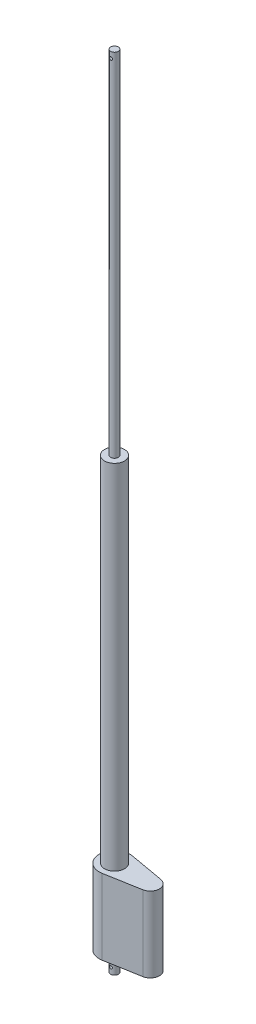
ISO-10303-21;
HEADER;
FILE_DESCRIPTION(('STEP AP214'),'2;1');
FILE_NAME('part.step','',(''),(''),'','','');
FILE_SCHEMA(('AUTOMOTIVE_DESIGN { 1 0 10303 214 1 1 1 1 }'));
ENDSEC;
DATA;
#1=APPLICATION_CONTEXT('core data for automotive mechanical design processes');
#2=APPLICATION_PROTOCOL_DEFINITION('international standard','automotive_design',2000,#1);
#3=PRODUCT_CONTEXT('',#1,'mechanical');
#4=PRODUCT('Part','Part','',(#3));
#5=PRODUCT_RELATED_PRODUCT_CATEGORY('part','',(#4));
#6=PRODUCT_DEFINITION_FORMATION('','',#4);
#7=PRODUCT_DEFINITION_CONTEXT('part definition',#1,'design');
#8=PRODUCT_DEFINITION('design','',#6,#7);
#9=PRODUCT_DEFINITION_SHAPE('','',#8);
#10=(LENGTH_UNIT() NAMED_UNIT(*) SI_UNIT(.MILLI.,.METRE.));
#11=(NAMED_UNIT(*) PLANE_ANGLE_UNIT() SI_UNIT($,.RADIAN.));
#12=(NAMED_UNIT(*) SI_UNIT($,.STERADIAN.) SOLID_ANGLE_UNIT());
#13=UNCERTAINTY_MEASURE_WITH_UNIT(LENGTH_MEASURE(1.E-05),#10,'distance_accuracy_value','');
#14=(GEOMETRIC_REPRESENTATION_CONTEXT(3) GLOBAL_UNCERTAINTY_ASSIGNED_CONTEXT((#13)) GLOBAL_UNIT_ASSIGNED_CONTEXT((#10,
#11,#12)) REPRESENTATION_CONTEXT('',''));
#15=CARTESIAN_POINT('',(0.,0.,0.));
#16=DIRECTION('',(0.,0.,1.));
#17=DIRECTION('',(1.,0.,0.));
#18=AXIS2_PLACEMENT_3D('',#15,#16,#17);
#19=CARTESIAN_POINT('',(0.,1033.,0.));
#20=DIRECTION('',(0.,1.,0.));
#21=DIRECTION('',(0.,0.,1.));
#22=AXIS2_PLACEMENT_3D('',#19,#20,#21);
#23=CYLINDRICAL_SURFACE('',#22,4.99999999999996);
#24=CARTESIAN_POINT('',(0.,-2.,4.99999999999983));
#25=CARTESIAN_POINT('',(0.107493005442892,-1.99999014817627,4.99999271227068));
#26=CARTESIAN_POINT('',(0.215172564090674,-1.99128224791163,4.99649294306916));
#27=CARTESIAN_POINT('',(0.427496480417897,-1.95675229647877,4.98283453100625));
#28=CARTESIAN_POINT('',(0.532131777561248,-1.93088372091387,4.9726577869886));
#29=CARTESIAN_POINT('',(0.734953922727402,-1.86312392194117,4.94674209213102));
#30=CARTESIAN_POINT('',(0.833160661616957,-1.82128515378328,4.93102136364055));
#31=CARTESIAN_POINT('',(1.02107197032837,-1.72298082667346,4.89556610796061));
#32=CARTESIAN_POINT('',(1.11077947675099,-1.66652034508108,4.8758329745804));
#33=CARTESIAN_POINT('',(1.28350100757039,-1.53776450143907,4.83330886170402));
#34=CARTESIAN_POINT('',(1.36606227255021,-1.46489334375974,4.81042296929174));
#35=CARTESIAN_POINT('',(1.51817500478472,-1.30659999652323,4.76460576906177));
#36=CARTESIAN_POINT('',(1.58772010713353,-1.22117170278827,4.74167444453775));
#37=CARTESIAN_POINT('',(1.71487456729288,-1.03557192975774,4.69722791797119));
#38=CARTESIAN_POINT('',(1.77181498119547,-0.934913513976811,4.67582115964934));
#39=CARTESIAN_POINT('',(1.86775471903715,-0.724463601579966,4.63833647186775));
#40=CARTESIAN_POINT('',(1.90676256428583,-0.614676472151647,4.62225601244159));
#41=CARTESIAN_POINT('',(1.96389882339587,-0.394287666407905,4.59826357660801));
#42=CARTESIAN_POINT('',(1.98289396580565,-0.283948764423795,4.59001420355588));
#43=CARTESIAN_POINT('',(2.00217296164003,-0.0613650016927403,4.58164004049127));
#44=CARTESIAN_POINT('',(2.00246601631322,0.0508788946250068,4.58151125522751));
#45=CARTESIAN_POINT('',(1.98498936750454,0.265756671458036,4.58910500279977));
#46=CARTESIAN_POINT('',(1.96847531430514,0.368515714409023,4.59628175038433));
#47=CARTESIAN_POINT('',(1.91994688029782,0.569659556006705,4.61676187607819));
#48=CARTESIAN_POINT('',(1.88792979480463,0.668043588110299,4.63006632321656));
#49=CARTESIAN_POINT('',(1.80869473255107,0.860017836196033,4.66159485088513));
#50=CARTESIAN_POINT('',(1.76117986231532,0.953469239054682,4.67991379280771));
#51=CARTESIAN_POINT('',(1.65250646073221,1.13141581636156,4.71938116389873));
#52=CARTESIAN_POINT('',(1.59134280510084,1.2159076094028,4.74053065456831));
#53=CARTESIAN_POINT('',(1.45155059945444,1.38040972880199,4.78526736742254));
#54=CARTESIAN_POINT('',(1.37193746297064,1.45956872944601,4.80891664976135));
#55=CARTESIAN_POINT('',(1.2003144274302,1.60368447800203,4.85459824958265));
#56=CARTESIAN_POINT('',(1.10830206533444,1.66863839741028,4.87663024445308));
#57=CARTESIAN_POINT('',(0.912077652605846,1.78361744741582,4.91714681264532));
#58=CARTESIAN_POINT('',(0.807660491346481,1.83332228119704,4.93555270095398));
#59=CARTESIAN_POINT('',(0.591023765482885,1.91416786107805,4.96614828328742));
#60=CARTESIAN_POINT('',(0.478808196849677,1.9453180375574,4.97834113462365));
#61=CARTESIAN_POINT('',(0.256895887607823,1.9864482954197,4.99456139506894));
#62=CARTESIAN_POINT('',(0.147443293985538,1.99757245425355,4.99902945833497));
#63=CARTESIAN_POINT('',(-0.0718453098078142,2.00171310052861,5.00068478510614));
#64=CARTESIAN_POINT('',(-0.181681213223921,1.9947342815475,4.99787393582275));
#65=CARTESIAN_POINT('',(-0.393432739121984,1.963708247448,4.98557567063736));
#66=CARTESIAN_POINT('',(-0.495482491775471,1.94044201964902,4.97639391345507));
#67=CARTESIAN_POINT('',(-0.694135428060777,1.87856429169018,4.95259441405483));
#68=CARTESIAN_POINT('',(-0.790737910224841,1.83995082033131,4.93797597356514));
#69=CARTESIAN_POINT('',(-0.979078785816699,1.74721506032005,4.90416594770795));
#70=CARTESIAN_POINT('',(-1.0705780227554,1.69265452795685,4.88484815979787));
#71=CARTESIAN_POINT('',(-1.24344359124655,1.57005967609435,4.84373364745508));
#72=CARTESIAN_POINT('',(-1.32480584076112,1.50201995707738,4.82193593110254));
#73=CARTESIAN_POINT('',(-1.48072304302882,1.34912998705037,4.77645117638095));
#74=CARTESIAN_POINT('',(-1.55447393380606,1.26346645849379,4.75273441425035));
#75=CARTESIAN_POINT('',(-1.68675119741371,1.08055991699063,4.70741672917115));
#76=CARTESIAN_POINT('',(-1.74527506133751,0.983314999660049,4.68581615526494));
#77=CARTESIAN_POINT('',(-1.84580750193163,0.778538305405892,4.64714299907692));
#78=CARTESIAN_POINT('',(-1.88765059453445,0.670916000787687,4.63011630884771));
#79=CARTESIAN_POINT('',(-1.9522962197053,0.449266348284842,4.60323673477914));
#80=CARTESIAN_POINT('',(-1.97511280526931,0.335243794187572,4.59337855695981));
#81=CARTESIAN_POINT('',(-1.9997156172784,0.112872098225455,4.58271759299909));
#82=CARTESIAN_POINT('',(-2.00289708230287,0.0047051604066476,4.58131421008154));
#83=CARTESIAN_POINT('',(-1.99180315927752,-0.210544857713295,4.58614836033081));
#84=CARTESIAN_POINT('',(-1.97752998791378,-0.317628073902586,4.59238492324776));
#85=CARTESIAN_POINT('',(-1.93307136615365,-0.523332189855044,4.61126649079003));
#86=CARTESIAN_POINT('',(-1.90353749357098,-0.622120274433001,4.62364831827432));
#87=CARTESIAN_POINT('',(-1.83000544849101,-0.813378629613485,4.65324001232679));
#88=CARTESIAN_POINT('',(-1.78600328139382,-0.905847146899828,4.6704512120599));
#89=CARTESIAN_POINT('',(-1.68187276275973,-1.08760961927078,4.70898609604474));
#90=CARTESIAN_POINT('',(-1.62096533515949,-1.17641867013049,4.73048882313225));
#91=CARTESIAN_POINT('',(-1.4858921192715,-1.34299331720376,4.7746380437222));
#92=CARTESIAN_POINT('',(-1.41172233481813,-1.42075557212832,4.79728488048389));
#93=CARTESIAN_POINT('',(-1.24650550627247,-1.56820285326362,4.84293567087377));
#94=CARTESIAN_POINT('',(-1.15467600114614,-1.63703730689807,4.86586757962168));
#95=CARTESIAN_POINT('',(-0.959900320285786,-1.75833704262164,4.908004067137));
#96=CARTESIAN_POINT('',(-0.856949004547244,-1.81079471215253,4.92720691092889));
#97=CARTESIAN_POINT('',(-0.644738062495209,-1.89662221519029,4.95939714815844));
#98=CARTESIAN_POINT('',(-0.535631618219701,-1.93032932356034,4.97249363055011));
#99=CARTESIAN_POINT('',(-0.312876546281226,-1.97863912095427,4.99144306209349));
#100=CARTESIAN_POINT('',(-0.199243525858918,-1.99330243674391,4.99731899495621));
#101=CARTESIAN_POINT('',(-0.0569122978909333,-1.99939538097828,4.9997589950412));
#102=CARTESIAN_POINT('',(-0.0284626887407602,-2.0000026086292,5.00000192969159));
#103=CARTESIAN_POINT('',(0.,-2.,4.99999999999983));
#104=B_SPLINE_CURVE_WITH_KNOTS('',3,(#24,#25,#26,#27,#28,#29,#30,#31,#32,#33,#34,#35,#36,#37,
#38,#39,#40,#41,#42,#43,#44,#45,#46,#47,#48,#49,#50,#51,#52,#53,#54,#55,#56,#57,#58,#59,#60,#61,
#62,#63,#64,#65,#66,#67,#68,#69,#70,#71,#72,#73,#74,#75,#76,#77,#78,#79,#80,#81,#82,#83,#84,#85,
#86,#87,#88,#89,#90,#91,#92,#93,#94,#95,#96,#97,#98,#99,#100,#101,#102,#103),.UNSPECIFIED.,.T.,
.F.,(4,2,2,2,2,2,2,2,2,2,2,2,2,2,2,2,2,2,2,2,2,2,2,2,2,2,2,2,2,2,2,2,2,2,2,2,2,2,2,4),(0.,
0.322402987893072,0.645683636007933,0.967911457471579,1.29002753567984,1.62597381700397,
1.96208394934411,2.31315258819217,2.66405423118268,2.99904105308828,3.33386306340488,
3.64538328401372,3.95695787256047,4.27489126298816,4.59294421938183,4.93558349186557,
5.27829092839732,5.62776913162806,5.9770695611379,6.30569184528007,6.63422893570082,
6.94800455564365,7.26182048993796,7.58523513398262,7.90877959498968,8.25368474624413,
8.59864669043748,8.94695045140827,9.29499672645933,9.61799673392748,9.94095572563045,
10.2511431854877,10.5614163580516,10.8894546805669,11.2175920134839,11.5670042353384,
11.9165786364053,12.2596430101332,12.6016125240434,12.686980458968),.UNSPECIFIED.);
#105=CARTESIAN_POINT('',(0.,-2.,4.99999999999983));
#106=VERTEX_POINT('',#105);
#107=EDGE_CURVE('E37',#106,#106,#104,.T.);
#108=ORIENTED_EDGE('',*,*,#107,.F.);
#109=EDGE_LOOP('',(#108));
#110=FACE_BOUND('',#109,.T.);
#111=CARTESIAN_POINT('',(2.,0.,-4.58257569495593));
#112=CARTESIAN_POINT('',(1.99999540068022,-0.107123689712964,-4.58258022779745));
#113=CARTESIAN_POINT('',(1.99134173553407,-0.21442629433185,-4.58638433797131));
#114=CARTESIAN_POINT('',(1.95706710874823,-0.42593908409958,-4.60111083306608));
#115=CARTESIAN_POINT('',(1.93140279032341,-0.530140654338525,-4.61205140628355));
#116=CARTESIAN_POINT('',(1.86423554476216,-0.732051808970832,-4.63960410719231));
#117=CARTESIAN_POINT('',(1.82279228998551,-0.829784243291227,-4.65619484260891));
#118=CARTESIAN_POINT('',(1.72542013194152,-1.01688535486231,-4.69314677188882));
#119=CARTESIAN_POINT('',(1.66949439157707,-1.10625585252411,-4.7135071422062));
#120=CARTESIAN_POINT('',(1.54132201423254,-1.27926031454434,-4.75700861562344));
#121=CARTESIAN_POINT('',(1.46837936836551,-1.36235639939725,-4.78023917022615));
#122=CARTESIAN_POINT('',(1.30970909513215,-1.51552902085581,-4.82612457915286));
#123=CARTESIAN_POINT('',(1.22397701877347,-1.58560100770971,-4.8487792299177));
#124=CARTESIAN_POINT('',(1.03800631337303,-1.71340639030972,-4.89203407641404));
#125=CARTESIAN_POINT('',(0.937328966419094,-1.77054429968594,-4.91251803612579));
#126=CARTESIAN_POINT('',(0.726825322068639,-1.8668435701738,-4.94803927702525));
#127=CARTESIAN_POINT('',(0.617002769076884,-1.90601224624887,-4.96307877403258));
#128=CARTESIAN_POINT('',(0.396966427039755,-1.96334148599309,-4.98538324990618));
#129=CARTESIAN_POINT('',(0.287028984858318,-1.98242731397023,-4.99298936770637));
#130=CARTESIAN_POINT('',(0.0652663285839635,-2.00202848578146,-5.0008031068744));
#131=CARTESIAN_POINT('',(-0.0465581658394097,-2.0025507559658,-5.00101348770565));
#132=CARTESIAN_POINT('',(-0.262232494702087,-1.98551723019581,-4.99421962820621));
#133=CARTESIAN_POINT('',(-0.366177452870455,-1.96897522724529,-4.98761996771494));
#134=CARTESIAN_POINT('',(-0.569673109221912,-1.92000712369704,-4.9684929146915));
#135=CARTESIAN_POINT('',(-0.669223484391237,-1.88757985760154,-4.95596508721351));
#136=CARTESIAN_POINT('',(-0.862897938510556,-1.80736351712175,-4.92596824457476));
#137=CARTESIAN_POINT('',(-0.956917623378893,-1.75935028518462,-4.90842760466232));
#138=CARTESIAN_POINT('',(-1.13580815074131,-1.64953499308085,-4.87014585180284));
#139=CARTESIAN_POINT('',(-1.22067584271796,-1.58772820689984,-4.84940364267158));
#140=CARTESIAN_POINT('',(-1.38476882799017,-1.44735086405613,-4.80521637176131));
#141=CARTESIAN_POINT('',(-1.46325784526632,-1.36794610742721,-4.78168326511768));
#142=CARTESIAN_POINT('',(-1.60610741539265,-1.19700942816801,-4.73561660973272));
#143=CARTESIAN_POINT('',(-1.67046334378698,-1.10547355180441,-4.71308339008085));
#144=CARTESIAN_POINT('',(-1.78490418871927,-0.909580977626072,-4.67096897409032));
#145=CARTESIAN_POINT('',(-1.83453465163626,-0.804935169661359,-4.65148914057717));
#146=CARTESIAN_POINT('',(-1.91517625986646,-0.587784509687789,-4.61887590344093));
#147=CARTESIAN_POINT('',(-1.94619949837798,-0.475284815273421,-4.60573837891319));
#148=CARTESIAN_POINT('',(-1.9869549488549,-0.252964222532574,-4.58829759702725));
#149=CARTESIAN_POINT('',(-1.99787209681454,-0.143399552871451,-4.58350366456146));
#150=CARTESIAN_POINT('',(-2.00156132644289,0.0760772077595488,-4.58189497869047));
#151=CARTESIAN_POINT('',(-1.99433891059128,0.185989183275644,-4.58507780560371));
#152=CARTESIAN_POINT('',(-1.96303289479003,0.396458934956933,-4.59856044359122));
#153=CARTESIAN_POINT('',(-1.93993306202386,0.497192937400051,-4.6084445779831));
#154=CARTESIAN_POINT('',(-1.87880418691087,0.693288404785443,-4.63370051027348));
#155=CARTESIAN_POINT('',(-1.84077183430228,0.788648673107141,-4.64907352488607));
#156=CARTESIAN_POINT('',(-1.74913563948158,0.975602357795646,-4.6843378186011));
#157=CARTESIAN_POINT('',(-1.69496286826465,1.06688618869452,-4.70438704639186));
#158=CARTESIAN_POINT('',(-1.57316522444183,1.23948298744158,-4.74650385157804));
#159=CARTESIAN_POINT('',(-1.5055348734819,1.32079187279544,-4.76857224896053));
#160=CARTESIAN_POINT('',(-1.35284421168058,1.47737340859936,-4.81420915971425));
#161=CARTESIAN_POINT('',(-1.26686542944544,1.55175656529159,-4.83776807285242));
#162=CARTESIAN_POINT('',(-1.08308363336851,1.68517707660976,-4.88219794567541));
#163=CARTESIAN_POINT('',(-0.985280138466613,1.74421380659511,-4.90306879593144));
#164=CARTESIAN_POINT('',(-0.780279934003019,1.84504762646333,-4.93983715900398));
#165=CARTESIAN_POINT('',(-0.673085480998749,1.88684884417366,-4.95573586240669));
#166=CARTESIAN_POINT('',(-0.452393590914552,1.95154885239975,-4.98072713468913));
#167=CARTESIAN_POINT('',(-0.338899610276824,1.97445790141068,-4.98982339706112));
#168=CARTESIAN_POINT('',(-0.11681651036262,1.99950470165284,-4.99979008211867));
#169=CARTESIAN_POINT('',(-0.00839049265209137,2.00290012856202,-5.00115846749754));
#170=CARTESIAN_POINT('',(0.207433835792261,1.99214452061653,-4.9968604237373));
#171=CARTESIAN_POINT('',(0.314832299614382,1.97799614184441,-4.99119505948783));
#172=CARTESIAN_POINT('',(0.522170901733392,1.93345321200011,-4.97371513381845));
#173=CARTESIAN_POINT('',(0.622238803864863,1.90357105524344,-4.96209480699007));
#174=CARTESIAN_POINT('',(0.815922355542598,1.82894719411892,-4.93394947767367));
#175=CARTESIAN_POINT('',(0.909536811189117,1.7842027490609,-4.91742357062868));
#176=CARTESIAN_POINT('',(1.09220303880515,1.67889680664676,-4.88018094611876));
#177=CARTESIAN_POINT('',(1.18087037518738,1.61772372467486,-4.85931130687209));
#178=CARTESIAN_POINT('',(1.34705404014793,1.482211461253,-4.81589402227089));
#179=CARTESIAN_POINT('',(1.42456572919734,1.40786683039178,-4.79334568464262));
#180=CARTESIAN_POINT('',(1.57120121894449,1.24268485315134,-4.74737767367689));
#181=CARTESIAN_POINT('',(1.63950871002775,1.1511114248559,-4.72399047228105));
#182=CARTESIAN_POINT('',(1.75984762763149,0.957057564279172,-4.68049656850758));
#183=CARTESIAN_POINT('',(1.81187714055767,0.854575851546455,-4.66039025195457));
#184=CARTESIAN_POINT('',(1.89399048451634,0.650963813529803,-4.62758914239072));
#185=CARTESIAN_POINT('',(1.92562535665267,0.550538397287558,-4.61439096680424));
#186=CARTESIAN_POINT('',(1.97271990928489,0.345510958507359,-4.59445826034128));
#187=CARTESIAN_POINT('',(1.98822466191608,0.240921426575645,-4.58770572290444));
#188=CARTESIAN_POINT('',(1.99692202185513,0.113221760888479,-4.58391763942099));
#189=CARTESIAN_POINT('',(1.99807530751895,0.0905985196435663,-4.58341531117293));
#190=CARTESIAN_POINT('',(1.9996148112425,0.0453195232027725,-4.58274384722731));
#191=CARTESIAN_POINT('',(2.0000009730612,0.0226637657448366,-4.58257473595929));
#192=CARTESIAN_POINT('',(2.,0.,-4.58257569495593));
#193=B_SPLINE_CURVE_WITH_KNOTS('',3,(#111,#112,#113,#114,#115,#116,#117,#118,#119,#120,#121,
#122,#123,#124,#125,#126,#127,#128,#129,#130,#131,#132,#133,#134,#135,#136,#137,#138,#139,#140,
#141,#142,#143,#144,#145,#146,#147,#148,#149,#150,#151,#152,#153,#154,#155,#156,#157,#158,#159,
#160,#161,#162,#163,#164,#165,#166,#167,#168,#169,#170,#171,#172,#173,#174,#175,#176,#177,#178,
#179,#180,#181,#182,#183,#184,#185,#186,#187,#188,#189,#190,#191,#192),.UNSPECIFIED.,.T.,.F.,(4,
2,2,2,2,2,2,2,2,2,2,2,2,2,2,2,2,2,2,2,2,2,2,2,2,2,2,2,2,2,2,2,2,2,2,2,2,2,2,2,4),(0.,
0.321277648767654,0.643377335822245,0.96427082329339,1.28509428823861,1.62255618284425,
1.96013574348342,2.31102669091428,2.6617746696948,2.99554182887183,3.32918445305672,
3.64408644830302,3.95901155129059,4.27868300234898,4.59846414940031,4.93924044081355,
5.28012807127127,5.63064458717257,5.98093304800101,6.3098214752442,6.63861014907939,
6.94867248085145,7.25880358651638,7.58151154652701,7.90435114525849,8.25103734246979,
8.59773764852748,8.94435487312812,9.29078375954136,9.61461039755953,9.93838801512602,
10.2522199444335,10.5661097782859,10.8938705113992,11.2217671656421,11.5699625328561,
11.9181988175919,12.2351666081908,12.5512463021924,12.619212852096,12.6871843847256),.UNSPECIFIED.);
#194=CARTESIAN_POINT('',(2.,0.,-4.58257569495593));
#195=VERTEX_POINT('',#194);
#196=EDGE_CURVE('E193',#195,#195,#193,.T.);
#197=ORIENTED_EDGE('',*,*,#196,.F.);
#198=EDGE_LOOP('',(#197));
#199=FACE_BOUND('',#198,.T.);
#200=CARTESIAN_POINT('',(0.,-8.00000000000001,-1.30104260698261E-13));
#201=DIRECTION('',(0.,1.,0.));
#202=DIRECTION('',(0.,0.,1.));
#203=AXIS2_PLACEMENT_3D('',#200,#201,#202);
#204=CIRCLE('',#203,4.99999999999994);
#205=CARTESIAN_POINT('',(0.,-8.00000000000001,4.99999999999981));
#206=VERTEX_POINT('',#205);
#207=EDGE_CURVE('E11',#206,#206,#204,.T.);
#208=ORIENTED_EDGE('',*,*,#207,.T.);
#209=EDGE_LOOP('',(#208));
#210=FACE_BOUND('',#209,.T.);
#211=CARTESIAN_POINT('',(0.,16.9999999999999,-1.25667467946303E-13));
#212=DIRECTION('',(0.,1.,0.));
#213=DIRECTION('',(0.,0.,1.));
#214=AXIS2_PLACEMENT_3D('',#211,#212,#213);
#215=CIRCLE('',#214,4.99999999999999);
#216=CARTESIAN_POINT('',(0.,16.9999999999999,4.99999999999986));
#217=VERTEX_POINT('',#216);
#218=EDGE_CURVE('E115',#217,#217,#215,.T.);
#219=ORIENTED_EDGE('',*,*,#218,.F.);
#220=EDGE_LOOP('',(#219));
#221=FACE_BOUND('',#220,.T.);
#222=ADVANCED_FACE('F33',(#110,#199,#210,#221),#23,.T.);
#223=CARTESIAN_POINT('',(0.,-8.,4.99999999999981));
#224=DIRECTION('',(0.,-1.,0.));
#225=DIRECTION('',(0.,0.,-1.));
#226=AXIS2_PLACEMENT_3D('',#223,#224,#225);
#227=PLANE('',#226);
#228=ORIENTED_EDGE('',*,*,#207,.F.);
#229=EDGE_LOOP('',(#228));
#230=FACE_BOUND('',#229,.T.);
#231=ADVANCED_FACE('F181',(#230),#227,.T.);
#232=CARTESIAN_POINT('',(0.,1033.,5.));
#233=DIRECTION('',(0.,1.,0.));
#234=DIRECTION('',(0.,0.,1.));
#235=AXIS2_PLACEMENT_3D('',#232,#233,#234);
#236=PLANE('',#235);
#237=CARTESIAN_POINT('',(0.,1033.,0.));
#238=DIRECTION('',(0.,1.,0.));
#239=DIRECTION('',(0.,0.,1.));
#240=AXIS2_PLACEMENT_3D('',#237,#238,#239);
#241=CIRCLE('',#240,4.99999999999994);
#242=CARTESIAN_POINT('',(0.,1033.,5.));
#243=VERTEX_POINT('',#242);
#244=EDGE_CURVE('E46',#243,#243,#241,.T.);
#245=ORIENTED_EDGE('',*,*,#244,.T.);
#246=EDGE_LOOP('',(#245));
#247=FACE_BOUND('',#246,.T.);
#248=ADVANCED_FACE('F177',(#247),#236,.T.);
#249=CARTESIAN_POINT('',(0.,1033.,0.));
#250=DIRECTION('',(0.,1.,0.));
#251=DIRECTION('',(0.,0.,1.));
#252=AXIS2_PLACEMENT_3D('',#249,#250,#251);
#253=CYLINDRICAL_SURFACE('',#252,4.99999999999998);
#254=CARTESIAN_POINT('',(0.,1023.,5.00000000000004));
#255=CARTESIAN_POINT('',(0.107493005442876,1023.00000985182,4.99999271227088));
#256=CARTESIAN_POINT('',(0.215172564090642,1023.00871775209,4.99649294306936));
#257=CARTESIAN_POINT('',(0.427496480417861,1023.04324770352,4.98283453100646));
#258=CARTESIAN_POINT('',(0.532131777561225,1023.06911627909,4.97265778698881));
#259=CARTESIAN_POINT('',(0.734953922727397,1023.13687607806,4.94674209213122));
#260=CARTESIAN_POINT('',(0.833160661616957,1023.17871484622,4.93102136364076));
#261=CARTESIAN_POINT('',(1.02107197032835,1023.27701917333,4.89556610796082));
#262=CARTESIAN_POINT('',(1.11077947675096,1023.33347965492,4.87583297458061));
#263=CARTESIAN_POINT('',(1.28350100757031,1023.46223549856,4.83330886170424));
#264=CARTESIAN_POINT('',(1.36606227255009,1023.53510665624,4.81042296929198));
#265=CARTESIAN_POINT('',(1.5181750047846,1023.69340000348,4.76460576906202));
#266=CARTESIAN_POINT('',(1.58772010713345,1023.77882829721,4.74167444453799));
#267=CARTESIAN_POINT('',(1.71487456729283,1023.96442807024,4.69722791797142));
#268=CARTESIAN_POINT('',(1.77181498119543,1024.06508648602,4.67582115964957));
#269=CARTESIAN_POINT('',(1.86775471903711,1024.27553639842,4.63833647186797));
#270=CARTESIAN_POINT('',(1.90676256428581,1024.38532352785,4.6222560124418));
#271=CARTESIAN_POINT('',(1.96389882339584,1024.60571233359,4.59826357660823));
#272=CARTESIAN_POINT('',(1.98289396580561,1024.71605123558,4.5900142035561));
#273=CARTESIAN_POINT('',(2.00217296163999,1024.93863499831,4.58164004049149));
#274=CARTESIAN_POINT('',(2.00246601631318,1025.05087889463,4.58151125522774));
#275=CARTESIAN_POINT('',(1.98498936750448,1025.26575667146,4.5891050028));
#276=CARTESIAN_POINT('',(1.96847531430506,1025.36851571441,4.59628175038457));
#277=CARTESIAN_POINT('',(1.91994688029774,1025.56965955601,4.61676187607843));
#278=CARTESIAN_POINT('',(1.88792979480456,1025.66804358811,4.63006632321679));
#279=CARTESIAN_POINT('',(1.80869473255102,1025.8600178362,4.66159485088536));
#280=CARTESIAN_POINT('',(1.76117986231529,1025.95346923905,4.67991379280793));
#281=CARTESIAN_POINT('',(1.65250646073218,1026.13141581636,4.71938116389895));
#282=CARTESIAN_POINT('',(1.59134280510076,1026.2159076094,4.74053065456855));
#283=CARTESIAN_POINT('',(1.45155059945432,1026.3804097288,4.78526736742278));
#284=CARTESIAN_POINT('',(1.37193746297056,1026.45956872945,4.80891664976157));
#285=CARTESIAN_POINT('',(1.20031442743019,1026.603684478,4.85459824958286));
#286=CARTESIAN_POINT('',(1.10830206533446,1026.66863839741,4.87663024445328));
#287=CARTESIAN_POINT('',(0.912077652605897,1026.78361744742,4.91714681264551));
#288=CARTESIAN_POINT('',(0.807660491346529,1026.8333222812,4.93555270095418));
#289=CARTESIAN_POINT('',(0.591023765482931,1026.91416786108,4.96614828328762));
#290=CARTESIAN_POINT('',(0.478808196849723,1026.94531803756,4.97834113462386));
#291=CARTESIAN_POINT('',(0.256895887607846,1026.98644829542,4.99456139506914));
#292=CARTESIAN_POINT('',(0.147443293985537,1026.99757245425,4.99902945833518));
#293=CARTESIAN_POINT('',(-0.0718453098078472,1027.00171310053,5.00068478510635));
#294=CARTESIAN_POINT('',(-0.181681213223964,1026.99473428155,4.99787393582295));
#295=CARTESIAN_POINT('',(-0.393432739122079,1026.96370824745,4.98557567063756));
#296=CARTESIAN_POINT('',(-0.495482491775607,1026.94044201965,4.97639391345526));
#297=CARTESIAN_POINT('',(-0.694135428060905,1026.87856429169,4.95259441405502));
#298=CARTESIAN_POINT('',(-0.790737910224921,1026.83995082033,4.93797597356533));
#299=CARTESIAN_POINT('',(-0.97907878581674,1026.74721506032,4.90416594770814));
#300=CARTESIAN_POINT('',(-1.07057802275546,1026.69265452796,4.88484815979806));
#301=CARTESIAN_POINT('',(-1.24344359124662,1026.57005967609,4.84373364745527));
#302=CARTESIAN_POINT('',(-1.32480584076118,1026.50201995708,4.82193593110273));
#303=CARTESIAN_POINT('',(-1.48072304302888,1026.34912998705,4.77645117638113));
#304=CARTESIAN_POINT('',(-1.55447393380615,1026.26346645849,4.75273441425053));
#305=CARTESIAN_POINT('',(-1.68675119741382,1026.08055991699,4.70741672917132));
#306=CARTESIAN_POINT('',(-1.74527506133761,1025.98331499966,4.68581615526511));
#307=CARTESIAN_POINT('',(-1.84580750193171,1025.77853830541,4.64714299907709));
#308=CARTESIAN_POINT('',(-1.88765059453454,1025.67091600079,4.63011630884788));
#309=CARTESIAN_POINT('',(-1.95229621970538,1025.44926634828,4.60323673477932));
#310=CARTESIAN_POINT('',(-1.97511280526937,1025.33524379419,4.59337855696));
#311=CARTESIAN_POINT('',(-1.99971561727845,1025.11287209823,4.58271759299928));
#312=CARTESIAN_POINT('',(-2.00289708230293,1025.00470516041,4.58131421008172));
#313=CARTESIAN_POINT('',(-1.9918031592776,1024.78945514229,4.58614836033098));
#314=CARTESIAN_POINT('',(-1.97752998791385,1024.6823719261,4.59238492324794));
#315=CARTESIAN_POINT('',(-1.93307136615375,1024.47666781015,4.6112664907902));
#316=CARTESIAN_POINT('',(-1.90353749357109,1024.37787972557,4.62364831827448));
#317=CARTESIAN_POINT('',(-1.83000544849115,1024.18662137039,4.65324001232695));
#318=CARTESIAN_POINT('',(-1.78600328139395,1024.0941528531,4.67045121206005));
#319=CARTESIAN_POINT('',(-1.68187276275987,1023.91239038073,4.7089860960449));
#320=CARTESIAN_POINT('',(-1.62096533515962,1023.82358132987,4.73048882313241));
#321=CARTESIAN_POINT('',(-1.48589211927162,1023.6570066828,4.77463804372237));
#322=CARTESIAN_POINT('',(-1.41172233481824,1023.57924442787,4.79728488048407));
#323=CARTESIAN_POINT('',(-1.24650550627255,1023.43179714674,4.84293567087395));
#324=CARTESIAN_POINT('',(-1.15467600114621,1023.3629626931,4.86586757962187));
#325=CARTESIAN_POINT('',(-0.959900320285857,1023.24166295738,4.90800406713719));
#326=CARTESIAN_POINT('',(-0.856949004547346,1023.18920528785,4.92720691092908));
#327=CARTESIAN_POINT('',(-0.644738062495349,1023.10337778481,4.95939714815863));
#328=CARTESIAN_POINT('',(-0.535631618219852,1023.06967067644,4.9724936305503));
#329=CARTESIAN_POINT('',(-0.312876546281383,1023.02136087905,4.99144306209369));
#330=CARTESIAN_POINT('',(-0.199243525859068,1023.00669756326,4.99731899495641));
#331=CARTESIAN_POINT('',(-0.0569122978910354,1023.00060461902,4.9997589950414));
#332=CARTESIAN_POINT('',(-0.0284626887408113,1022.99999739137,5.00000192969179));
#333=CARTESIAN_POINT('',(0.,1023.,5.00000000000004));
#334=B_SPLINE_CURVE_WITH_KNOTS('',3,(#254,#255,#256,#257,#258,#259,#260,#261,#262,#263,#264,
#265,#266,#267,#268,#269,#270,#271,#272,#273,#274,#275,#276,#277,#278,#279,#280,#281,#282,#283,
#284,#285,#286,#287,#288,#289,#290,#291,#292,#293,#294,#295,#296,#297,#298,#299,#300,#301,#302,
#303,#304,#305,#306,#307,#308,#309,#310,#311,#312,#313,#314,#315,#316,#317,#318,#319,#320,#321,
#322,#323,#324,#325,#326,#327,#328,#329,#330,#331,#332,#333),.UNSPECIFIED.,.T.,.F.,(4,2,2,2,2,2,
2,2,2,2,2,2,2,2,2,2,2,2,2,2,2,2,2,2,2,2,2,2,2,2,2,2,2,2,2,2,2,2,2,4),(0.,0.322402987893034,
0.64568363600791,0.967911457471574,1.2900275356798,1.62597381700375,1.962083949344,
2.31315258819214,2.66405423118273,2.99904105308829,3.3338630634049,3.64538328401369,
3.95695787256048,4.27489126298794,4.59294421938189,4.9355834918655,5.27829092839713,
5.6277691316279,5.97706956113776,6.30569184527998,6.6342289357008,6.94800455564366,
7.26182048993798,7.5852351339825,7.90877959498967,8.2536847462441,8.59864669043767,
8.94695045140826,9.29499672645918,9.61799673392732,9.94095572563015,10.2511431854875,
10.5614163580515,10.8894546805667,11.2175920134838,11.5670042353383,11.9165786364053,
12.2596430101331,12.6016125240433,12.686980458968),.UNSPECIFIED.);
#335=CARTESIAN_POINT('',(0.,1023.,5.00000000000004));
#336=VERTEX_POINT('',#335);
#337=EDGE_CURVE('E141',#336,#336,#334,.T.);
#338=ORIENTED_EDGE('',*,*,#337,.F.);
#339=EDGE_LOOP('',(#338));
#340=FACE_BOUND('',#339,.T.);
#341=CARTESIAN_POINT('',(1.99999999999995,1025.,-4.58257569495579));
#342=CARTESIAN_POINT('',(1.99999540068017,1024.89287631029,-4.58258022779732));
#343=CARTESIAN_POINT('',(1.99134173553401,1024.78557370567,-4.58638433797118));
#344=CARTESIAN_POINT('',(1.95706710874819,1024.5740609159,-4.60111083306595));
#345=CARTESIAN_POINT('',(1.93140279032337,1024.46985934566,-4.61205140628341));
#346=CARTESIAN_POINT('',(1.86423554476212,1024.26794819103,-4.63960410719216));
#347=CARTESIAN_POINT('',(1.82279228998546,1024.17021575671,-4.65619484260877));
#348=CARTESIAN_POINT('',(1.72542013194151,1023.98311464514,-4.69314677188867));
#349=CARTESIAN_POINT('',(1.66949439157711,1023.89374414748,-4.71350714220603));
#350=CARTESIAN_POINT('',(1.54132201423266,1023.72073968546,-4.75700861562325));
#351=CARTESIAN_POINT('',(1.46837936836564,1023.6376436006,-4.78023917022595));
#352=CARTESIAN_POINT('',(1.30970909513224,1023.48447097914,-4.82612457915268));
#353=CARTESIAN_POINT('',(1.22397701877349,1023.41439899229,-4.84877922991754));
#354=CARTESIAN_POINT('',(1.03800631337302,1023.28659360969,-4.89203407641388));
#355=CARTESIAN_POINT('',(0.937328966419146,1023.22945570031,-4.91251803612562));
#356=CARTESIAN_POINT('',(0.726825322068721,1023.13315642983,-4.94803927702508));
#357=CARTESIAN_POINT('',(0.617002769076936,1023.09398775375,-4.96307877403242));
#358=CARTESIAN_POINT('',(0.396966427039795,1023.03665851401,-4.98538324990602));
#359=CARTESIAN_POINT('',(0.287028984858375,1023.01757268603,-4.99298936770621));
#360=CARTESIAN_POINT('',(0.0652663285840321,1022.99797151422,-5.00080310687424));
#361=CARTESIAN_POINT('',(-0.0465581658393467,1022.99744924403,-5.0010134877055));
#362=CARTESIAN_POINT('',(-0.262232494702041,1023.0144827698,-4.99421962820606));
#363=CARTESIAN_POINT('',(-0.366177452870419,1023.03102477275,-4.98761996771479));
#364=CARTESIAN_POINT('',(-0.569673109221889,1023.0799928763,-4.96849291469135));
#365=CARTESIAN_POINT('',(-0.669223484391218,1023.1124201424,-4.95596508721335));
#366=CARTESIAN_POINT('',(-0.862897938510521,1023.19263648288,-4.92596824457461));
#367=CARTESIAN_POINT('',(-0.95691762337884,1023.24064971482,-4.90842760466218));
#368=CARTESIAN_POINT('',(-1.13580815074127,1023.35046500692,-4.87014585180269));
#369=CARTESIAN_POINT('',(-1.22067584271795,1023.4122717931,-4.84940364267143));
#370=CARTESIAN_POINT('',(-1.38476882799017,1023.55264913594,-4.80521637176116));
#371=CARTESIAN_POINT('',(-1.4632578452663,1023.63205389257,-4.78168326511752));
#372=CARTESIAN_POINT('',(-1.60610741539261,1023.80299057183,-4.73561660973257));
#373=CARTESIAN_POINT('',(-1.67046334378694,1023.8945264482,-4.71308339008071));
#374=CARTESIAN_POINT('',(-1.78490418871926,1024.09041902237,-4.67096897409017));
#375=CARTESIAN_POINT('',(-1.83453465163629,1024.19506483034,-4.651489140577));
#376=CARTESIAN_POINT('',(-1.91517625986651,1024.41221549031,-4.61887590344076));
#377=CARTESIAN_POINT('',(-1.94619949837802,1024.52471518473,-4.60573837891303));
#378=CARTESIAN_POINT('',(-1.98695494885493,1024.74703577747,-4.58829759702708));
#379=CARTESIAN_POINT('',(-1.99787209681459,1024.85660044713,-4.58350366456129));
#380=CARTESIAN_POINT('',(-2.00156132644295,1025.07607720776,-4.58189497869029));
#381=CARTESIAN_POINT('',(-1.99433891059134,1025.18598918328,-4.58507780560352));
#382=CARTESIAN_POINT('',(-1.9630328947901,1025.39645893496,-4.59856044359103));
#383=CARTESIAN_POINT('',(-1.93993306202395,1025.4971929374,-4.60844457798291));
#384=CARTESIAN_POINT('',(-1.87880418691095,1025.69328840479,-4.6337005102733));
#385=CARTESIAN_POINT('',(-1.84077183430234,1025.78864867311,-4.64907352488588));
#386=CARTESIAN_POINT('',(-1.74913563948163,1025.9756023578,-4.68433781860092));
#387=CARTESIAN_POINT('',(-1.6949628682647,1026.06688618869,-4.70438704639168));
#388=CARTESIAN_POINT('',(-1.57316522444186,1026.23948298744,-4.74650385157787));
#389=CARTESIAN_POINT('',(-1.50553487348194,1026.3207918728,-4.76857224896036));
#390=CARTESIAN_POINT('',(-1.35284421168063,1026.4773734086,-4.81420915971408));
#391=CARTESIAN_POINT('',(-1.26686542944549,1026.55175656529,-4.83776807285225));
#392=CARTESIAN_POINT('',(-1.08308363336856,1026.68517707661,-4.88219794567524));
#393=CARTESIAN_POINT('',(-0.985280138466672,1026.7442138066,-4.90306879593127));
#394=CARTESIAN_POINT('',(-0.780279934003102,1026.84504762646,-4.93983715900381));
#395=CARTESIAN_POINT('',(-0.673085480998845,1026.88684884417,-4.95573586240652));
#396=CARTESIAN_POINT('',(-0.452393590914679,1026.9515488524,-4.98072713468896));
#397=CARTESIAN_POINT('',(-0.33889961027697,1026.97445790141,-4.98982339706095));
#398=CARTESIAN_POINT('',(-0.116816510362784,1026.99950470165,-4.99979008211851));
#399=CARTESIAN_POINT('',(-0.0083904926522537,1027.00290012856,-5.00115846749738));
#400=CARTESIAN_POINT('',(0.207433835792098,1026.99214452062,-4.99686042373715));
#401=CARTESIAN_POINT('',(0.314832299614217,1026.97799614184,-4.99119505948768));
#402=CARTESIAN_POINT('',(0.522170901733214,1026.933453212,-4.97371513381831));
#403=CARTESIAN_POINT('',(0.622238803864675,1026.90357105524,-4.96209480698993));
#404=CARTESIAN_POINT('',(0.815922355542409,1026.82894719412,-4.93394947767354));
#405=CARTESIAN_POINT('',(0.909536811188935,1026.78420274906,-4.91742357062855));
#406=CARTESIAN_POINT('',(1.09220303880496,1026.67889680665,-4.88018094611864));
#407=CARTESIAN_POINT('',(1.18087037518717,1026.61772372467,-4.85931130687198));
#408=CARTESIAN_POINT('',(1.34705404014773,1026.48221146125,-4.81589402227078));
#409=CARTESIAN_POINT('',(1.42456572919718,1026.40786683039,-4.7933456846425));
#410=CARTESIAN_POINT('',(1.57120121894436,1026.24268485315,-4.74737767367677));
#411=CARTESIAN_POINT('',(1.63950871002762,1026.15111142486,-4.72399047228094));
#412=CARTESIAN_POINT('',(1.75984762763137,1025.95705756428,-4.68049656850747));
#413=CARTESIAN_POINT('',(1.81187714055756,1025.85457585155,-4.66039025195446));
#414=CARTESIAN_POINT('',(1.8939904845163,1025.65096381353,-4.62758914239058));
#415=CARTESIAN_POINT('',(1.92562535665267,1025.55053839729,-4.61439096680408));
#416=CARTESIAN_POINT('',(1.97271990928486,1025.34551095851,-4.59445826034114));
#417=CARTESIAN_POINT('',(1.98822466191602,1025.24092142658,-4.5877057229043));
#418=CARTESIAN_POINT('',(1.99692202185507,1025.11322176089,-4.58391763942086));
#419=CARTESIAN_POINT('',(1.9980753075189,1025.09059851964,-4.58341531117279));
#420=CARTESIAN_POINT('',(1.99961481124245,1025.0453195232,-4.58274384722718));
#421=CARTESIAN_POINT('',(2.00000097306115,1025.02266376574,-4.58257473595915));
#422=CARTESIAN_POINT('',(1.99999999999995,1025.,-4.58257569495579));
#423=B_SPLINE_CURVE_WITH_KNOTS('',3,(#341,#342,#343,#344,#345,#346,#347,#348,#349,#350,#351,
#352,#353,#354,#355,#356,#357,#358,#359,#360,#361,#362,#363,#364,#365,#366,#367,#368,#369,#370,
#371,#372,#373,#374,#375,#376,#377,#378,#379,#380,#381,#382,#383,#384,#385,#386,#387,#388,#389,
#390,#391,#392,#393,#394,#395,#396,#397,#398,#399,#400,#401,#402,#403,#404,#405,#406,#407,#408,
#409,#410,#411,#412,#413,#414,#415,#416,#417,#418,#419,#420,#421,#422),.UNSPECIFIED.,.T.,.F.,(4,
2,2,2,2,2,2,2,2,2,2,2,2,2,2,2,2,2,2,2,2,2,2,2,2,2,2,2,2,2,2,2,2,2,2,2,2,2,2,2,4),(0.,
0.321277648767564,0.643377335822211,0.964270823293334,1.2850942882383,1.62255618284393,
1.96013574348334,2.31102669091417,2.6617746696947,2.99554182887171,3.32918445305661,
3.64408644830291,3.9590115512905,4.27868300234886,4.59846414940032,4.93924044081351,
5.28012807127108,5.63064458717244,5.98093304800091,6.30982147524402,6.63861014907922,
6.94867248085139,7.25880358651622,7.58151154652712,7.90435114525851,8.25103734246989,
8.5977376485275,8.9443548731281,9.29078375954126,9.61461039755944,9.93838801512593,
10.2522199444334,10.5661097782858,10.8938705113991,11.2217671656419,11.5699625328561,
11.9181988175918,12.2351666081911,12.5512463021924,12.6192128520959,12.6871843847256),.UNSPECIFIED.);
#424=CARTESIAN_POINT('',(1.99999999999995,1025.,-4.58257569495579));
#425=VERTEX_POINT('',#424);
#426=EDGE_CURVE('E114',#425,#425,#423,.T.);
#427=ORIENTED_EDGE('',*,*,#426,.F.);
#428=EDGE_LOOP('',(#427));
#429=FACE_BOUND('',#428,.T.);
#430=CARTESIAN_POINT('',(0.,575.,0.));
#431=DIRECTION('',(0.,1.,0.));
#432=DIRECTION('',(0.,0.,1.));
#433=AXIS2_PLACEMENT_3D('',#430,#431,#432);
#434=CIRCLE('',#433,5.00000000000002);
#435=CARTESIAN_POINT('',(0.,575.,5.));
#436=VERTEX_POINT('',#435);
#437=EDGE_CURVE('E129',#436,#436,#434,.T.);
#438=ORIENTED_EDGE('',*,*,#437,.T.);
#439=EDGE_LOOP('',(#438));
#440=FACE_BOUND('',#439,.T.);
#441=ORIENTED_EDGE('',*,*,#244,.F.);
#442=EDGE_LOOP('',(#441));
#443=FACE_BOUND('',#442,.T.);
#444=ADVANCED_FACE('F145',(#340,#429,#440,#443),#253,.T.);
#445=CARTESIAN_POINT('',(0.,575.,13.));
#446=DIRECTION('',(0.,1.,0.));
#447=DIRECTION('',(0.,0.,1.));
#448=AXIS2_PLACEMENT_3D('',#445,#446,#447);
#449=PLANE('',#448);
#450=CARTESIAN_POINT('',(0.,575.,0.));
#451=DIRECTION('',(0.,1.,0.));
#452=DIRECTION('',(0.,0.,1.));
#453=AXIS2_PLACEMENT_3D('',#450,#451,#452);
#454=CIRCLE('',#453,13.);
#455=CARTESIAN_POINT('',(0.,575.,13.));
#456=VERTEX_POINT('',#455);
#457=EDGE_CURVE('E126',#456,#456,#454,.T.);
#458=ORIENTED_EDGE('',*,*,#457,.T.);
#459=EDGE_LOOP('',(#458));
#460=FACE_BOUND('',#459,.T.);
#461=ORIENTED_EDGE('',*,*,#437,.F.);
#462=EDGE_LOOP('',(#461));
#463=FACE_BOUND('',#462,.T.);
#464=ADVANCED_FACE('F170',(#460,#463),#449,.T.);
#465=CARTESIAN_POINT('',(0.,1033.,0.));
#466=DIRECTION('',(0.,1.,0.));
#467=DIRECTION('',(0.,0.,1.));
#468=AXIS2_PLACEMENT_3D('',#465,#466,#467);
#469=CYLINDRICAL_SURFACE('',#468,13.);
#470=CARTESIAN_POINT('',(0.,115.,-1.08275240358627E-13));
#471=DIRECTION('',(0.,1.,0.));
#472=DIRECTION('',(0.,0.,1.));
#473=AXIS2_PLACEMENT_3D('',#470,#471,#472);
#474=CIRCLE('',#473,13.);
#475=CARTESIAN_POINT('',(0.,115.,12.9999999999999));
#476=VERTEX_POINT('',#475);
#477=EDGE_CURVE('E123',#476,#476,#474,.T.);
#478=ORIENTED_EDGE('',*,*,#477,.T.);
#479=EDGE_LOOP('',(#478));
#480=FACE_BOUND('',#479,.T.);
#481=ORIENTED_EDGE('',*,*,#457,.F.);
#482=EDGE_LOOP('',(#481));
#483=FACE_BOUND('',#482,.T.);
#484=ADVANCED_FACE('F168',(#480,#483),#469,.T.);
#485=CARTESIAN_POINT('',(0.,115.,12.9999999999999));
#486=DIRECTION('',(0.,1.,0.));
#487=DIRECTION('',(0.,0.,1.));
#488=AXIS2_PLACEMENT_3D('',#485,#486,#487);
#489=PLANE('',#488);
#490=CARTESIAN_POINT('',(0.,115.,-1.08275240358627E-13));
#491=DIRECTION('',(0.,1.,0.));
#492=DIRECTION('',(0.,0.,1.));
#493=AXIS2_PLACEMENT_3D('',#490,#491,#492);
#494=CIRCLE('',#493,20.);
#495=CARTESIAN_POINT('',(3.49102718940243,115.,-19.6929614117039));
#496=VERTEX_POINT('',#495);
#497=CARTESIAN_POINT('',(3.49102718940235,115.,19.6929614117038));
#498=VERTEX_POINT('',#497);
#499=EDGE_CURVE('E121',#496,#498,#494,.T.);
#500=ORIENTED_EDGE('',*,*,#499,.T.);
#501=DIRECTION('',(0.984648070585188,0.,-0.174551359470116));
#502=VECTOR('',#501,1.);
#503=CARTESIAN_POINT('',(48.6292420888951,115.,11.6911818824166));
#504=LINE('',#503,#502);
#505=CARTESIAN_POINT('',(48.6292420888951,115.,11.6911818824166));
#506=VERTEX_POINT('',#505);
#507=EDGE_CURVE('E63',#498,#506,#504,.T.);
#508=ORIENTED_EDGE('',*,*,#507,.T.);
#509=CARTESIAN_POINT('',(46.5567130784281,115.,0.));
#510=DIRECTION('',(0.,1.,0.));
#511=DIRECTION('',(0.,0.,-1.));
#512=AXIS2_PLACEMENT_3D('',#509,#510,#511);
#513=CIRCLE('',#512,11.8734624397002);
#514=CARTESIAN_POINT('',(48.6292420888952,115.,-11.6911818824164));
#515=VERTEX_POINT('',#514);
#516=EDGE_CURVE('E90',#506,#515,#513,.T.);
#517=ORIENTED_EDGE('',*,*,#516,.T.);
#518=DIRECTION('',(-0.984648070585188,0.,-0.174551359470121));
#519=VECTOR('',#518,1.);
#520=CARTESIAN_POINT('',(3.49102718940243,115.,-19.6929614117039));
#521=LINE('',#520,#519);
#522=EDGE_CURVE('E98',#515,#496,#521,.T.);
#523=ORIENTED_EDGE('',*,*,#522,.T.);
#524=EDGE_LOOP('',(#500,#508,#517,#523));
#525=FACE_BOUND('',#524,.T.);
#526=ORIENTED_EDGE('',*,*,#477,.F.);
#527=EDGE_LOOP('',(#526));
#528=FACE_BOUND('',#527,.T.);
#529=ADVANCED_FACE('F96',(#525,#528),#489,.T.);
#530=CARTESIAN_POINT('',(0.,1033.,0.));
#531=DIRECTION('',(0.,1.,0.));
#532=DIRECTION('',(0.,0.,1.));
#533=AXIS2_PLACEMENT_3D('',#530,#531,#532);
#534=CYLINDRICAL_SURFACE('',#533,20.);
#535=DIRECTION('',(0.,1.,0.));
#536=VECTOR('',#535,1.);
#537=CARTESIAN_POINT('',(3.49102718940235,-71.0414245216674,19.6929614117038));
#538=LINE('',#537,#536);
#539=CARTESIAN_POINT('',(3.49102718940236,17.,19.6929614117038));
#540=VERTEX_POINT('',#539);
#541=EDGE_CURVE('E110',#540,#498,#538,.T.);
#542=ORIENTED_EDGE('',*,*,#541,.T.);
#543=ORIENTED_EDGE('',*,*,#499,.F.);
#544=DIRECTION('',(0.,1.,0.));
#545=VECTOR('',#544,1.);
#546=CARTESIAN_POINT('',(3.49102718940243,-71.0414245216674,-19.6929614117039));
#547=LINE('',#546,#545);
#548=CARTESIAN_POINT('',(3.49102718940244,16.9999999999999,-19.6929614117039));
#549=VERTEX_POINT('',#548);
#550=EDGE_CURVE('E102',#549,#496,#547,.T.);
#551=ORIENTED_EDGE('',*,*,#550,.F.);
#552=CARTESIAN_POINT('',(0.,16.9999999999999,-1.25667467946303E-13));
#553=DIRECTION('',(0.,1.,0.));
#554=DIRECTION('',(0.,0.,1.));
#555=AXIS2_PLACEMENT_3D('',#552,#553,#554);
#556=CIRCLE('',#555,20.0000000000001);
#557=EDGE_CURVE('E118',#549,#540,#556,.T.);
#558=ORIENTED_EDGE('',*,*,#557,.T.);
#559=EDGE_LOOP('',(#542,#543,#551,#558));
#560=FACE_BOUND('',#559,.T.);
#561=ADVANCED_FACE('F161',(#560),#534,.T.);
#562=CARTESIAN_POINT('',(0.,17.,4.99999999999986));
#563=DIRECTION('',(0.,-1.,0.));
#564=DIRECTION('',(0.,0.,-1.));
#565=AXIS2_PLACEMENT_3D('',#562,#563,#564);
#566=PLANE('',#565);
#567=ORIENTED_EDGE('',*,*,#218,.T.);
#568=EDGE_LOOP('',(#567));
#569=FACE_BOUND('',#568,.T.);
#570=ORIENTED_EDGE('',*,*,#557,.F.);
#571=DIRECTION('',(-0.984648070585188,0.,-0.174551359470121));
#572=VECTOR('',#571,1.);
#573=CARTESIAN_POINT('',(3.49102718940243,17.,-19.6929614117039));
#574=LINE('',#573,#572);
#575=CARTESIAN_POINT('',(48.6292420888952,17.,-11.6911818824165));
#576=VERTEX_POINT('',#575);
#577=EDGE_CURVE('E54',#576,#549,#574,.T.);
#578=ORIENTED_EDGE('',*,*,#577,.F.);
#579=CARTESIAN_POINT('',(46.5567130784281,17.,0.));
#580=DIRECTION('',(0.,-1.,0.));
#581=DIRECTION('',(0.,0.,-1.));
#582=AXIS2_PLACEMENT_3D('',#579,#580,#581);
#583=CIRCLE('',#582,11.8734624397002);
#584=CARTESIAN_POINT('',(48.6292420888951,17.,11.6911818824165));
#585=VERTEX_POINT('',#584);
#586=EDGE_CURVE('E82',#585,#576,#583,.F.);
#587=ORIENTED_EDGE('',*,*,#586,.F.);
#588=DIRECTION('',(0.984648070585189,0.,-0.174551359470116));
#589=VECTOR('',#588,1.);
#590=CARTESIAN_POINT('',(48.6292420888951,17.,11.6911818824166));
#591=LINE('',#590,#589);
#592=EDGE_CURVE('E79',#540,#585,#591,.T.);
#593=ORIENTED_EDGE('',*,*,#592,.F.);
#594=EDGE_LOOP('',(#570,#578,#587,#593));
#595=FACE_BOUND('',#594,.T.);
#596=ADVANCED_FACE('F154',(#569,#595),#566,.T.);
#597=CARTESIAN_POINT('',(0.,1025.,-20.0000000000002));
#598=DIRECTION('',(0.,0.,1.));
#599=DIRECTION('',(1.,0.,0.));
#600=AXIS2_PLACEMENT_3D('',#597,#598,#599);
#601=CYLINDRICAL_SURFACE('',#600,2.);
#602=ORIENTED_EDGE('',*,*,#337,.T.);
#603=EDGE_LOOP('',(#602));
#604=FACE_BOUND('',#603,.T.);
#605=ORIENTED_EDGE('',*,*,#426,.T.);
#606=EDGE_LOOP('',(#605));
#607=FACE_BOUND('',#606,.T.);
#608=ADVANCED_FACE('F149',(#604,#607),#601,.F.);
#609=CARTESIAN_POINT('',(0.,0.,-20.0000000000002));
#610=DIRECTION('',(0.,0.,1.));
#611=DIRECTION('',(1.,0.,0.));
#612=AXIS2_PLACEMENT_3D('',#609,#610,#611);
#613=CYLINDRICAL_SURFACE('',#612,2.);
#614=ORIENTED_EDGE('',*,*,#107,.T.);
#615=EDGE_LOOP('',(#614));
#616=FACE_BOUND('',#615,.T.);
#617=ORIENTED_EDGE('',*,*,#196,.T.);
#618=EDGE_LOOP('',(#617));
#619=FACE_BOUND('',#618,.T.);
#620=ADVANCED_FACE('F153',(#616,#619),#613,.F.);
#621=CARTESIAN_POINT('',(48.6292420888951,-71.0414245216674,11.6911818824166));
#622=DIRECTION('',(0.174551359470116,0.,0.984648070585189));
#623=DIRECTION('',(0.984648070585189,0.,-0.174551359470116));
#624=AXIS2_PLACEMENT_3D('',#621,#622,#623);
#625=PLANE('',#624);
#626=ORIENTED_EDGE('',*,*,#541,.F.);
#627=ORIENTED_EDGE('',*,*,#592,.T.);
#628=DIRECTION('',(0.,1.,0.));
#629=VECTOR('',#628,1.);
#630=CARTESIAN_POINT('',(48.6292420888951,-71.0414245216674,11.6911818824165));
#631=LINE('',#630,#629);
#632=EDGE_CURVE('E104',#585,#506,#631,.T.);
#633=ORIENTED_EDGE('',*,*,#632,.T.);
#634=ORIENTED_EDGE('',*,*,#507,.F.);
#635=EDGE_LOOP('',(#626,#627,#633,#634));
#636=FACE_BOUND('',#635,.T.);
#637=ADVANCED_FACE('F197',(#636),#625,.T.);
#638=CARTESIAN_POINT('',(46.5567130784281,-71.0414245216674,0.));
#639=DIRECTION('',(0.,1.,0.));
#640=DIRECTION('',(0.,0.,1.));
#641=AXIS2_PLACEMENT_3D('',#638,#639,#640);
#642=CYLINDRICAL_SURFACE('',#641,11.8734624397002);
#643=ORIENTED_EDGE('',*,*,#632,.F.);
#644=ORIENTED_EDGE('',*,*,#586,.T.);
#645=DIRECTION('',(0.,1.,0.));
#646=VECTOR('',#645,1.);
#647=CARTESIAN_POINT('',(48.6292420888952,-71.0414245216674,-11.6911818824165));
#648=LINE('',#647,#646);
#649=EDGE_CURVE('E87',#576,#515,#648,.T.);
#650=ORIENTED_EDGE('',*,*,#649,.T.);
#651=ORIENTED_EDGE('',*,*,#516,.F.);
#652=EDGE_LOOP('',(#643,#644,#650,#651));
#653=FACE_BOUND('',#652,.T.);
#654=ADVANCED_FACE('F89',(#653),#642,.T.);
#655=CARTESIAN_POINT('',(3.49102718940243,-71.0414245216674,-19.6929614117039));
#656=DIRECTION('',(0.174551359470121,0.,-0.984648070585188));
#657=DIRECTION('',(-0.984648070585188,0.,-0.174551359470121));
#658=AXIS2_PLACEMENT_3D('',#655,#656,#657);
#659=PLANE('',#658);
#660=ORIENTED_EDGE('',*,*,#649,.F.);
#661=ORIENTED_EDGE('',*,*,#577,.T.);
#662=ORIENTED_EDGE('',*,*,#550,.T.);
#663=ORIENTED_EDGE('',*,*,#522,.F.);
#664=EDGE_LOOP('',(#660,#661,#662,#663));
#665=FACE_BOUND('',#664,.T.);
#666=ADVANCED_FACE('F101',(#665),#659,.T.);
#667=CLOSED_SHELL('',(#222,#231,#248,#444,#464,#484,#529,#561,#596,#608,#620,#637,#654,#666));
#668=MANIFOLD_SOLID_BREP('B2',#667);
#669=ADVANCED_BREP_SHAPE_REPRESENTATION('',(#18,#668),#14);
#670=SHAPE_DEFINITION_REPRESENTATION(#9,#669);
ENDSEC;
END-ISO-10303-21;
